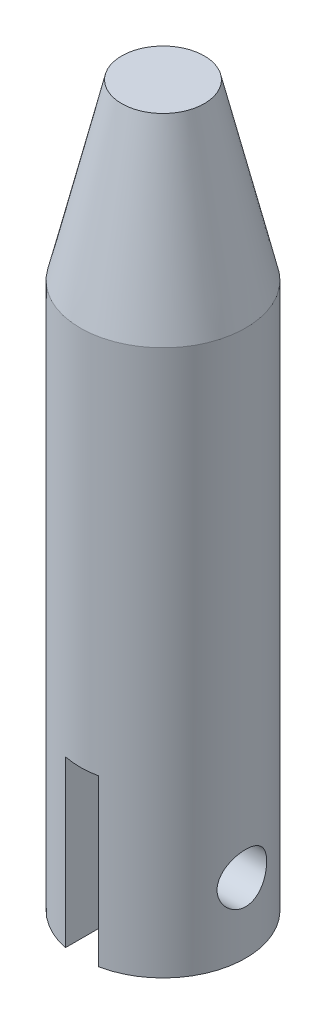
ISO-10303-21;
HEADER;
FILE_DESCRIPTION(('STEP AP214'),'2;1');
FILE_NAME('part.step','',(''),(''),'','','');
FILE_SCHEMA(('AUTOMOTIVE_DESIGN { 1 0 10303 214 1 1 1 1 }'));
ENDSEC;
DATA;
#1=APPLICATION_CONTEXT('core data for automotive mechanical design processes');
#2=APPLICATION_PROTOCOL_DEFINITION('international standard','automotive_design',2000,#1);
#3=PRODUCT_CONTEXT('',#1,'mechanical');
#4=PRODUCT('Part','Part','',(#3));
#5=PRODUCT_RELATED_PRODUCT_CATEGORY('part','',(#4));
#6=PRODUCT_DEFINITION_FORMATION('','',#4);
#7=PRODUCT_DEFINITION_CONTEXT('part definition',#1,'design');
#8=PRODUCT_DEFINITION('design','',#6,#7);
#9=PRODUCT_DEFINITION_SHAPE('','',#8);
#10=(LENGTH_UNIT() NAMED_UNIT(*) SI_UNIT(.MILLI.,.METRE.));
#11=(NAMED_UNIT(*) PLANE_ANGLE_UNIT() SI_UNIT($,.RADIAN.));
#12=(NAMED_UNIT(*) SI_UNIT($,.STERADIAN.) SOLID_ANGLE_UNIT());
#13=UNCERTAINTY_MEASURE_WITH_UNIT(LENGTH_MEASURE(1.E-05),#10,'distance_accuracy_value','');
#14=(GEOMETRIC_REPRESENTATION_CONTEXT(3) GLOBAL_UNCERTAINTY_ASSIGNED_CONTEXT((#13)) GLOBAL_UNIT_ASSIGNED_CONTEXT((#10,
#11,#12)) REPRESENTATION_CONTEXT('',''));
#15=CARTESIAN_POINT('',(0.,0.,0.));
#16=DIRECTION('',(0.,0.,1.));
#17=DIRECTION('',(1.,0.,0.));
#18=AXIS2_PLACEMENT_3D('',#15,#16,#17);
#19=CARTESIAN_POINT('',(0.,43.5,0.));
#20=DIRECTION('',(0.,-1.,0.));
#21=DIRECTION('',(0.,0.,-1.));
#22=AXIS2_PLACEMENT_3D('',#19,#20,#21);
#23=CYLINDRICAL_SURFACE('',#22,5.);
#24=CARTESIAN_POINT('',(0.,33.,0.));
#25=DIRECTION('',(0.,1.,0.));
#26=DIRECTION('',(0.,0.,1.));
#27=AXIS2_PLACEMENT_3D('',#24,#25,#26);
#28=CIRCLE('',#27,5.);
#29=CARTESIAN_POINT('',(0.,33.,5.));
#30=VERTEX_POINT('',#29);
#31=EDGE_CURVE('E93',#30,#30,#28,.T.);
#32=ORIENTED_EDGE('',*,*,#31,.F.);
#33=EDGE_LOOP('',(#32));
#34=FACE_BOUND('',#33,.T.);
#35=CARTESIAN_POINT('',(-4.76969600708473,4.2,-1.5));
#36=CARTESIAN_POINT('',(-4.7696968572698,4.1178054520576,-1.49999897633764));
#37=CARTESIAN_POINT('',(-4.77184390209069,4.03560077585598,-1.49322108167142));
#38=CARTESIAN_POINT('',(-4.780165783029,3.87359475040806,-1.46635844446749));
#39=CARTESIAN_POINT('',(-4.78634196493468,3.79379421349854,-1.44626925573578));
#40=CARTESIAN_POINT('',(-4.80196102485632,3.63896527172827,-1.39352753269955));
#41=CARTESIAN_POINT('',(-4.81139846703232,3.56392917036692,-1.36089589394243));
#42=CARTESIAN_POINT('',(-4.83246932547567,3.4203780660047,-1.28406421917929));
#43=CARTESIAN_POINT('',(-4.84410307041019,3.35186404131556,-1.23986245137053));
#44=CARTESIAN_POINT('',(-4.86866862185765,3.22113360942262,-1.13964754141627));
#45=CARTESIAN_POINT('',(-4.88162808311636,3.15915410205371,-1.08333207175807));
#46=CARTESIAN_POINT('',(-4.90714861936757,3.04536204867749,-0.961136237579599));
#47=CARTESIAN_POINT('',(-4.91970964297705,2.99355080955012,-0.895254645461111));
#48=CARTESIAN_POINT('',(-4.94333214579389,2.90053730016669,-0.75411143779369));
#49=CARTESIAN_POINT('',(-4.95435724342404,2.85957657555719,-0.678684021335814));
#50=CARTESIAN_POINT('',(-4.97334435920684,2.79101274095724,-0.521624645369354));
#51=CARTESIAN_POINT('',(-4.98130703789495,2.76340675014255,-0.439994028387912));
#52=CARTESIAN_POINT('',(-4.99307646003589,2.72311999890949,-0.27532385263083));
#53=CARTESIAN_POINT('',(-4.99699557369338,2.7100348723473,-0.192391398953801));
#54=CARTESIAN_POINT('',(-5.00063201501348,2.69788267535356,-0.0254218237493151));
#55=CARTESIAN_POINT('',(-5.00035022521079,2.69881266059804,0.0586150620503681));
#56=CARTESIAN_POINT('',(-4.99569603817658,2.71439286854302,0.22257115660016));
#57=CARTESIAN_POINT('',(-4.9914542020526,2.72860519380987,0.302536267641341));
#58=CARTESIAN_POINT('',(-4.97951522112593,2.76963133599429,0.458889213442527));
#59=CARTESIAN_POINT('',(-4.97181785750586,2.79644595094267,0.535276821322846));
#60=CARTESIAN_POINT('',(-4.95365220986963,2.86221202341856,0.683347326351281));
#61=CARTESIAN_POINT('',(-4.94315269676706,2.90130120280727,0.754965064694478));
#62=CARTESIAN_POINT('',(-4.92049640648069,2.99039785242823,0.890764673783156));
#63=CARTESIAN_POINT('',(-4.90833923637778,3.04040791296348,0.954944774872131));
#64=CARTESIAN_POINT('',(-4.88311550488165,3.1521977507516,1.0766604815298));
#65=CARTESIAN_POINT('',(-4.87003195321461,3.21435691902974,1.13384458040111));
#66=CARTESIAN_POINT('',(-4.84483979887497,3.34751001789005,1.23707651539824));
#67=CARTESIAN_POINT('',(-4.8327312931702,3.41850482538923,1.28312324482853));
#68=CARTESIAN_POINT('',(-4.81077903197678,3.56823946924899,1.3631399533545));
#69=CARTESIAN_POINT('',(-4.80095810695957,3.64704704586292,1.39698989237679));
#70=CARTESIAN_POINT('',(-4.78496392548436,3.80960720844554,1.45083362878413));
#71=CARTESIAN_POINT('',(-4.7787894791583,3.89335817153456,1.4708319464056));
#72=CARTESIAN_POINT('',(-4.77104849541241,4.06008236073928,1.49574770282165));
#73=CARTESIAN_POINT('',(-4.7693187867044,4.14296822389398,1.50119946380212));
#74=CARTESIAN_POINT('',(-4.77021192441924,4.30847290000987,1.49835947233062));
#75=CARTESIAN_POINT('',(-4.77283416156589,4.39109174873085,1.4900696437133));
#76=CARTESIAN_POINT('',(-4.78197558554912,4.55148837797087,1.4604576357419));
#77=CARTESIAN_POINT('',(-4.78839176507489,4.62933616426352,1.4394796143128));
#78=CARTESIAN_POINT('',(-4.80429141231227,4.78040169081492,1.3854857774794));
#79=CARTESIAN_POINT('',(-4.81377535359073,4.85361871414057,1.3524681034276));
#80=CARTESIAN_POINT('',(-4.83505835023047,4.99551746407213,1.274318711965));
#81=CARTESIAN_POINT('',(-4.84691271069799,5.06402472098579,1.22888564172729));
#82=CARTESIAN_POINT('',(-4.87148205646987,5.1926381061808,1.12755301600385));
#83=CARTESIAN_POINT('',(-4.88419724730003,5.25274221761279,1.07165095534897));
#84=CARTESIAN_POINT('',(-4.90963633548158,5.36518040581474,0.948455132493599));
#85=CARTESIAN_POINT('',(-4.92234245063004,5.41713562898698,0.880811065857434));
#86=CARTESIAN_POINT('',(-4.9458485174865,5.50896670102775,0.737461784590248));
#87=CARTESIAN_POINT('',(-4.95664856384717,5.54884314978146,0.661756970543943));
#88=CARTESIAN_POINT('',(-4.97505970474957,5.6150000305683,0.504935504705221));
#89=CARTESIAN_POINT('',(-4.98269453424965,5.64138201615898,0.423864622037839));
#90=CARTESIAN_POINT('',(-4.99401979596827,5.68006091889042,0.258169966504588));
#91=CARTESIAN_POINT('',(-4.9977113567088,5.69236186594842,0.173547217354763));
#92=CARTESIAN_POINT('',(-5.00066544081399,5.7022230440545,0.00665215388274314));
#93=CARTESIAN_POINT('',(-5.00009305111322,5.70033269540783,-0.0755851790862063));
#94=CARTESIAN_POINT('',(-4.99497264465036,5.68317836750088,-0.238519481164404));
#95=CARTESIAN_POINT('',(-4.99042485330462,5.66791514651956,-0.319216537346528));
#96=CARTESIAN_POINT('',(-4.97791168358326,5.62478833860038,-0.475935813041358));
#97=CARTESIAN_POINT('',(-4.96998352900866,5.59706181935099,-0.551998927351392));
#98=CARTESIAN_POINT('',(-4.9515294303945,5.52991808549281,-0.698433237752053));
#99=CARTESIAN_POINT('',(-4.94100305949946,5.49049894971381,-0.76880349605058));
#100=CARTESIAN_POINT('',(-4.91803965828228,5.39962654256997,-0.904301892420563));
#101=CARTESIAN_POINT('',(-4.90555226923559,5.34782856999923,-0.969190250076766));
#102=CARTESIAN_POINT('',(-4.88023537212334,5.2342896116672,-1.08953757134594));
#103=CARTESIAN_POINT('',(-4.86740576641079,5.17254576210185,-1.14499380960193));
#104=CARTESIAN_POINT('',(-4.84240680631319,5.03865922168949,-1.24656269394549));
#105=CARTESIAN_POINT('',(-4.83026852693485,4.96626144660956,-1.29234759757956));
#106=CARTESIAN_POINT('',(-4.80852547508793,4.81444482583898,-1.37104313528776));
#107=CARTESIAN_POINT('',(-4.79891948596955,4.7350293763988,-1.40395995557289));
#108=CARTESIAN_POINT('',(-4.78427816717594,4.58025956839373,-1.4530194253295));
#109=CARTESIAN_POINT('',(-4.7788615484052,4.50539135306901,-1.47058859011232));
#110=CARTESIAN_POINT('',(-4.77157042597167,4.35368477750423,-1.49407818835144));
#111=CARTESIAN_POINT('',(-4.7696952122143,4.27684681535475,-1.50000095706095));
#112=CARTESIAN_POINT('',(-4.76969600708473,4.2,-1.5));
#113=B_SPLINE_CURVE_WITH_KNOTS('',3,(#35,#36,#37,#38,#39,#40,#41,#42,#43,#44,#45,#46,#47,#48,
#49,#50,#51,#52,#53,#54,#55,#56,#57,#58,#59,#60,#61,#62,#63,#64,#65,#66,#67,#68,#69,#70,#71,#72,
#73,#74,#75,#76,#77,#78,#79,#80,#81,#82,#83,#84,#85,#86,#87,#88,#89,#90,#91,#92,#93,#94,#95,#96,
#97,#98,#99,#100,#101,#102,#103,#104,#105,#106,#107,#108,#109,#110,#111,#112),.UNSPECIFIED.,.T.,
.F.,(4,2,2,2,2,2,2,2,2,2,2,2,2,2,2,2,2,2,2,2,2,2,2,2,2,2,2,2,2,2,2,2,2,2,2,2,2,2,4),(0.,
0.246300165915542,0.492682641689,0.738656414466193,0.984667025370101,1.23773150007984,
1.49082847871273,1.74915939273645,2.00743455587877,2.25832140149558,2.5091555410144,
2.7520012599088,2.99486235890376,3.24055209335676,3.48630016590831,3.74152147023278,
3.99676812491863,4.25446238246266,4.51207250628411,4.76008080790309,5.00805439107388,
5.24958594938817,5.49115481045787,5.73920731809388,5.98731925928923,6.24479506100602,
6.50225807324202,6.75775391814325,7.01317662321682,7.2587630391122,7.50433553047755,
7.74727096872219,7.99024634491378,8.24099627054488,8.4918185262989,8.75011639669147,
9.00828993963944,9.23861153857448,9.4688869503356),.UNSPECIFIED.);
#114=CARTESIAN_POINT('',(-4.76969600708473,4.2,-1.5));
#115=VERTEX_POINT('',#114);
#116=EDGE_CURVE('E106',#115,#115,#113,.T.);
#117=ORIENTED_EDGE('',*,*,#116,.F.);
#118=EDGE_LOOP('',(#117));
#119=FACE_BOUND('',#118,.T.);
#120=CARTESIAN_POINT('',(4.76969600708473,4.2,1.5));
#121=CARTESIAN_POINT('',(4.7696968572698,4.2821945479424,1.49999897633764));
#122=CARTESIAN_POINT('',(4.77184390209069,4.36439922414402,1.49322108167142));
#123=CARTESIAN_POINT('',(4.780165783029,4.52640524959194,1.46635844446749));
#124=CARTESIAN_POINT('',(4.78634196493468,4.60620578650147,1.44626925573578));
#125=CARTESIAN_POINT('',(4.80196102485632,4.76103472827173,1.39352753269955));
#126=CARTESIAN_POINT('',(4.81139846703232,4.83607082963309,1.36089589394243));
#127=CARTESIAN_POINT('',(4.83246932547567,4.9796219339953,1.28406421917929));
#128=CARTESIAN_POINT('',(4.84410307041019,5.04813595868444,1.23986245137053));
#129=CARTESIAN_POINT('',(4.86866862185765,5.17886639057738,1.13964754141627));
#130=CARTESIAN_POINT('',(4.88162808311636,5.24084589794629,1.08333207175807));
#131=CARTESIAN_POINT('',(4.90714861936757,5.35463795132251,0.961136237579599));
#132=CARTESIAN_POINT('',(4.91970964297705,5.40644919044988,0.895254645461111));
#133=CARTESIAN_POINT('',(4.94333214579389,5.49946269983331,0.75411143779369));
#134=CARTESIAN_POINT('',(4.95435724342404,5.54042342444281,0.678684021335814));
#135=CARTESIAN_POINT('',(4.97334435920684,5.60898725904276,0.521624645369353));
#136=CARTESIAN_POINT('',(4.98130703789495,5.63659324985745,0.439994028387911));
#137=CARTESIAN_POINT('',(4.99307646003589,5.67688000109051,0.275323852630829));
#138=CARTESIAN_POINT('',(4.99699557369338,5.6899651276527,0.192391398953801));
#139=CARTESIAN_POINT('',(5.00063201501348,5.70211732464644,0.0254218237493147));
#140=CARTESIAN_POINT('',(5.00035022521079,5.70118733940196,-0.0586150620503685));
#141=CARTESIAN_POINT('',(4.99569603817658,5.68560713145698,-0.22257115660016));
#142=CARTESIAN_POINT('',(4.9914542020526,5.67139480619013,-0.302536267641342));
#143=CARTESIAN_POINT('',(4.97951522112593,5.63036866400571,-0.458889213442527));
#144=CARTESIAN_POINT('',(4.97181785750586,5.60355404905733,-0.535276821322846));
#145=CARTESIAN_POINT('',(4.95365220986963,5.53778797658144,-0.683347326351281));
#146=CARTESIAN_POINT('',(4.94315269676706,5.49869879719273,-0.754965064694478));
#147=CARTESIAN_POINT('',(4.92049640648069,5.40960214757177,-0.890764673783156));
#148=CARTESIAN_POINT('',(4.90833923637778,5.35959208703652,-0.954944774872131));
#149=CARTESIAN_POINT('',(4.88311550488165,5.2478022492484,-1.0766604815298));
#150=CARTESIAN_POINT('',(4.87003195321461,5.18564308097026,-1.13384458040111));
#151=CARTESIAN_POINT('',(4.84483979887497,5.05248998210995,-1.23707651539824));
#152=CARTESIAN_POINT('',(4.8327312931702,4.98149517461077,-1.28312324482853));
#153=CARTESIAN_POINT('',(4.81077903197678,4.83176053075101,-1.3631399533545));
#154=CARTESIAN_POINT('',(4.80095810695957,4.75295295413708,-1.39698989237679));
#155=CARTESIAN_POINT('',(4.78496392548436,4.59039279155446,-1.45083362878413));
#156=CARTESIAN_POINT('',(4.7787894791583,4.50664182846544,-1.4708319464056));
#157=CARTESIAN_POINT('',(4.77104849541241,4.33991763926072,-1.49574770282165));
#158=CARTESIAN_POINT('',(4.7693187867044,4.25703177610602,-1.50119946380212));
#159=CARTESIAN_POINT('',(4.77021192441924,4.09152709999013,-1.49835947233062));
#160=CARTESIAN_POINT('',(4.77283416156589,4.00890825126915,-1.4900696437133));
#161=CARTESIAN_POINT('',(4.78197558554912,3.84851162202913,-1.4604576357419));
#162=CARTESIAN_POINT('',(4.78839176507489,3.77066383573648,-1.4394796143128));
#163=CARTESIAN_POINT('',(4.80429141231227,3.61959830918508,-1.3854857774794));
#164=CARTESIAN_POINT('',(4.81377535359073,3.54638128585943,-1.3524681034276));
#165=CARTESIAN_POINT('',(4.83505835023047,3.40448253592787,-1.274318711965));
#166=CARTESIAN_POINT('',(4.84691271069799,3.33597527901421,-1.22888564172729));
#167=CARTESIAN_POINT('',(4.87148205646987,3.2073618938192,-1.12755301600385));
#168=CARTESIAN_POINT('',(4.88419724730003,3.14725778238721,-1.07165095534897));
#169=CARTESIAN_POINT('',(4.90963633548158,3.03481959418526,-0.948455132493599));
#170=CARTESIAN_POINT('',(4.92234245063004,2.98286437101302,-0.880811065857434));
#171=CARTESIAN_POINT('',(4.9458485174865,2.89103329897225,-0.737461784590249));
#172=CARTESIAN_POINT('',(4.95664856384717,2.85115685021854,-0.661756970543944));
#173=CARTESIAN_POINT('',(4.97505970474957,2.78499996943171,-0.504935504705222));
#174=CARTESIAN_POINT('',(4.98269453424965,2.75861798384103,-0.423864622037839));
#175=CARTESIAN_POINT('',(4.99401979596827,2.71993908110958,-0.258169966504588));
#176=CARTESIAN_POINT('',(4.9977113567088,2.70763813405158,-0.173547217354763));
#177=CARTESIAN_POINT('',(5.00066544081399,2.6977769559455,-0.00665215388274299));
#178=CARTESIAN_POINT('',(5.00009305111322,2.69966730459217,0.0755851790862064));
#179=CARTESIAN_POINT('',(4.99497264465036,2.71682163249912,0.238519481164404));
#180=CARTESIAN_POINT('',(4.99042485330462,2.73208485348044,0.319216537346528));
#181=CARTESIAN_POINT('',(4.97791168358326,2.77521166139963,0.475935813041358));
#182=CARTESIAN_POINT('',(4.96998352900866,2.80293818064901,0.551998927351392));
#183=CARTESIAN_POINT('',(4.9515294303945,2.87008191450719,0.698433237752053));
#184=CARTESIAN_POINT('',(4.94100305949946,2.90950105028619,0.76880349605058));
#185=CARTESIAN_POINT('',(4.91803965828228,3.00037345743004,0.904301892420563));
#186=CARTESIAN_POINT('',(4.90555226923559,3.05217143000077,0.969190250076767));
#187=CARTESIAN_POINT('',(4.88023537212334,3.1657103883328,1.08953757134595));
#188=CARTESIAN_POINT('',(4.86740576641079,3.22745423789815,1.14499380960194));
#189=CARTESIAN_POINT('',(4.84240680631319,3.36134077831051,1.24656269394549));
#190=CARTESIAN_POINT('',(4.83026852693485,3.43373855339044,1.29234759757956));
#191=CARTESIAN_POINT('',(4.80852547508793,3.58555517416102,1.37104313528776));
#192=CARTESIAN_POINT('',(4.79891948596955,3.6649706236012,1.40395995557289));
#193=CARTESIAN_POINT('',(4.78427816717594,3.81974043160627,1.4530194253295));
#194=CARTESIAN_POINT('',(4.7788615484052,3.89460864693099,1.47058859011232));
#195=CARTESIAN_POINT('',(4.77157042597167,4.04631522249577,1.49407818835144));
#196=CARTESIAN_POINT('',(4.7696952122143,4.12315318464525,1.50000095706095));
#197=CARTESIAN_POINT('',(4.76969600708473,4.2,1.5));
#198=B_SPLINE_CURVE_WITH_KNOTS('',3,(#120,#121,#122,#123,#124,#125,#126,#127,#128,#129,#130,
#131,#132,#133,#134,#135,#136,#137,#138,#139,#140,#141,#142,#143,#144,#145,#146,#147,#148,#149,
#150,#151,#152,#153,#154,#155,#156,#157,#158,#159,#160,#161,#162,#163,#164,#165,#166,#167,#168,
#169,#170,#171,#172,#173,#174,#175,#176,#177,#178,#179,#180,#181,#182,#183,#184,#185,#186,#187,
#188,#189,#190,#191,#192,#193,#194,#195,#196,#197),.UNSPECIFIED.,.T.,.F.,(4,2,2,2,2,2,2,2,2,2,2,
2,2,2,2,2,2,2,2,2,2,2,2,2,2,2,2,2,2,2,2,2,2,2,2,2,2,2,4),(0.,0.246300165915542,0.492682641689,
0.738656414466193,0.984667025370101,1.23773150007984,1.49082847871273,1.74915939273645,
2.00743455587877,2.25832140149558,2.5091555410144,2.7520012599088,2.99486235890376,
3.24055209335676,3.4863001659083,3.74152147023278,3.99676812491863,4.25446238246266,
4.51207250628411,4.76008080790309,5.00805439107388,5.24958594938817,5.49115481045787,
5.73920731809388,5.98731925928923,6.24479506100602,6.50225807324202,6.75775391814325,
7.01317662321682,7.2587630391122,7.50433553047754,7.74727096872219,7.99024634491378,
8.24099627054488,8.4918185262989,8.75011639669147,9.00828993963944,9.23861153857448,
9.4688869503356),.UNSPECIFIED.);
#199=CARTESIAN_POINT('',(4.76969600708473,4.2,1.5));
#200=VERTEX_POINT('',#199);
#201=EDGE_CURVE('E97',#200,#200,#198,.T.);
#202=ORIENTED_EDGE('',*,*,#201,.T.);
#203=EDGE_LOOP('',(#202));
#204=FACE_BOUND('',#203,.T.);
#205=DIRECTION('',(0.,-1.,0.));
#206=VECTOR('',#205,1.);
#207=CARTESIAN_POINT('',(-1.,43.5,4.89897948556635));
#208=LINE('',#207,#206);
#209=CARTESIAN_POINT('',(-0.999999999999999,0.,4.89897948556636));
#210=VERTEX_POINT('',#209);
#211=CARTESIAN_POINT('',(-1.,10.,4.89897948556635));
#212=VERTEX_POINT('',#211);
#213=EDGE_CURVE('E78',#210,#212,#208,.F.);
#214=ORIENTED_EDGE('',*,*,#213,.T.);
#215=CARTESIAN_POINT('',(0.,10.,0.));
#216=DIRECTION('',(0.,-1.,0.));
#217=DIRECTION('',(0.,0.,-1.));
#218=AXIS2_PLACEMENT_3D('',#215,#216,#217);
#219=CIRCLE('',#218,5.);
#220=CARTESIAN_POINT('',(1.,10.,4.89897948556635));
#221=VERTEX_POINT('',#220);
#222=EDGE_CURVE('E82',#212,#221,#219,.F.);
#223=ORIENTED_EDGE('',*,*,#222,.T.);
#224=DIRECTION('',(0.,-1.,0.));
#225=VECTOR('',#224,1.);
#226=CARTESIAN_POINT('',(1.,43.5,4.89897948556635));
#227=LINE('',#226,#225);
#228=CARTESIAN_POINT('',(0.999999999999999,0.,4.89897948556636));
#229=VERTEX_POINT('',#228);
#230=EDGE_CURVE('E51',#221,#229,#227,.T.);
#231=ORIENTED_EDGE('',*,*,#230,.T.);
#232=CARTESIAN_POINT('',(0.,0.,0.));
#233=DIRECTION('',(0.,1.,0.));
#234=DIRECTION('',(0.,0.,1.));
#235=AXIS2_PLACEMENT_3D('',#232,#233,#234);
#236=CIRCLE('',#235,5.);
#237=CARTESIAN_POINT('',(0.999999999999999,0.,-4.89897948556636));
#238=VERTEX_POINT('',#237);
#239=EDGE_CURVE('E11',#229,#238,#236,.T.);
#240=ORIENTED_EDGE('',*,*,#239,.T.);
#241=DIRECTION('',(0.,-1.,0.));
#242=VECTOR('',#241,1.);
#243=CARTESIAN_POINT('',(1.,43.5,-4.89897948556635));
#244=LINE('',#243,#242);
#245=CARTESIAN_POINT('',(1.,10.,-4.89897948556635));
#246=VERTEX_POINT('',#245);
#247=EDGE_CURVE('E46',#246,#238,#244,.T.);
#248=ORIENTED_EDGE('',*,*,#247,.F.);
#249=CARTESIAN_POINT('',(0.,10.,0.));
#250=DIRECTION('',(0.,1.,0.));
#251=DIRECTION('',(0.,0.,1.));
#252=AXIS2_PLACEMENT_3D('',#249,#250,#251);
#253=CIRCLE('',#252,5.);
#254=CARTESIAN_POINT('',(-1.,10.,-4.89897948556635));
#255=VERTEX_POINT('',#254);
#256=EDGE_CURVE('E87',#255,#246,#253,.F.);
#257=ORIENTED_EDGE('',*,*,#256,.F.);
#258=DIRECTION('',(0.,-1.,0.));
#259=VECTOR('',#258,1.);
#260=CARTESIAN_POINT('',(-1.,43.5,-4.89897948556635));
#261=LINE('',#260,#259);
#262=CARTESIAN_POINT('',(-0.999999999999999,0.,-4.89897948556636));
#263=VERTEX_POINT('',#262);
#264=EDGE_CURVE('E75',#263,#255,#261,.F.);
#265=ORIENTED_EDGE('',*,*,#264,.F.);
#266=EDGE_CURVE('E39',#263,#210,#236,.T.);
#267=ORIENTED_EDGE('',*,*,#266,.T.);
#268=EDGE_LOOP('',(#214,#223,#231,#240,#248,#257,#265,#267));
#269=FACE_BOUND('',#268,.T.);
#270=ADVANCED_FACE('F32',(#34,#119,#204,#269),#23,.T.);
#271=CARTESIAN_POINT('',(0.,0.,0.));
#272=DIRECTION('',(0.,1.,0.));
#273=DIRECTION('',(0.,0.,1.));
#274=AXIS2_PLACEMENT_3D('',#271,#272,#273);
#275=PLANE('',#274);
#276=DIRECTION('',(0.,0.,-1.));
#277=VECTOR('',#276,1.);
#278=CARTESIAN_POINT('',(-0.999999999999999,0.,5.001));
#279=LINE('',#278,#277);
#280=EDGE_CURVE('E71',#210,#263,#279,.T.);
#281=ORIENTED_EDGE('',*,*,#280,.F.);
#282=ORIENTED_EDGE('',*,*,#266,.F.);
#283=EDGE_LOOP('',(#281,#282));
#284=FACE_BOUND('',#283,.T.);
#285=ADVANCED_FACE('F90',(#284),#275,.F.);
#286=DIRECTION('',(0.,0.,-1.));
#287=VECTOR('',#286,1.);
#288=CARTESIAN_POINT('',(0.999999999999999,0.,5.001));
#289=LINE('',#288,#287);
#290=EDGE_CURVE('E83',#229,#238,#289,.T.);
#291=ORIENTED_EDGE('',*,*,#290,.T.);
#292=ORIENTED_EDGE('',*,*,#239,.F.);
#293=EDGE_LOOP('',(#291,#292));
#294=FACE_BOUND('',#293,.T.);
#295=ADVANCED_FACE('F136',(#294),#275,.F.);
#296=CARTESIAN_POINT('',(5.001,4.2,0.));
#297=DIRECTION('',(-1.,0.,0.));
#298=DIRECTION('',(0.,0.,1.));
#299=AXIS2_PLACEMENT_3D('',#296,#297,#298);
#300=CYLINDRICAL_SURFACE('',#299,1.5);
#301=ORIENTED_EDGE('',*,*,#116,.T.);
#302=EDGE_LOOP('',(#301));
#303=FACE_BOUND('',#302,.T.);
#304=CARTESIAN_POINT('',(-0.999999999999999,4.2,0.));
#305=DIRECTION('',(1.,0.,0.));
#306=DIRECTION('',(0.,1.,0.));
#307=AXIS2_PLACEMENT_3D('',#304,#305,#306);
#308=CIRCLE('',#307,1.5);
#309=CARTESIAN_POINT('',(-0.999999999999999,5.7,0.));
#310=VERTEX_POINT('',#309);
#311=EDGE_CURVE('E151',#310,#310,#308,.F.);
#312=ORIENTED_EDGE('',*,*,#311,.F.);
#313=EDGE_LOOP('',(#312));
#314=FACE_BOUND('',#313,.T.);
#315=ADVANCED_FACE('F112',(#303,#314),#300,.F.);
#316=ORIENTED_EDGE('',*,*,#201,.F.);
#317=EDGE_LOOP('',(#316));
#318=FACE_BOUND('',#317,.T.);
#319=CARTESIAN_POINT('',(0.999999999999999,4.2,0.));
#320=DIRECTION('',(-1.,0.,0.));
#321=DIRECTION('',(0.,-1.,0.));
#322=AXIS2_PLACEMENT_3D('',#319,#320,#321);
#323=CIRCLE('',#322,1.5);
#324=CARTESIAN_POINT('',(0.999999999999999,2.7,0.));
#325=VERTEX_POINT('',#324);
#326=EDGE_CURVE('E88',#325,#325,#323,.F.);
#327=ORIENTED_EDGE('',*,*,#326,.F.);
#328=EDGE_LOOP('',(#327));
#329=FACE_BOUND('',#328,.T.);
#330=ADVANCED_FACE('F144',(#318,#329),#300,.F.);
#331=CARTESIAN_POINT('',(0.,43.5,0.));
#332=DIRECTION('',(0.,-1.,0.));
#333=DIRECTION('',(0.,0.,-1.));
#334=AXIS2_PLACEMENT_3D('',#331,#332,#333);
#335=CONICAL_SURFACE('',#334,2.5,0.233743180868901);
#336=ORIENTED_EDGE('',*,*,#31,.T.);
#337=EDGE_LOOP('',(#336));
#338=FACE_BOUND('',#337,.T.);
#339=CARTESIAN_POINT('',(0.,43.5,0.));
#340=DIRECTION('',(0.,1.,0.));
#341=DIRECTION('',(0.,0.,1.));
#342=AXIS2_PLACEMENT_3D('',#339,#340,#341);
#343=CIRCLE('',#342,2.5);
#344=CARTESIAN_POINT('',(0.,43.5,2.5));
#345=VERTEX_POINT('',#344);
#346=EDGE_CURVE('E91',#345,#345,#343,.T.);
#347=ORIENTED_EDGE('',*,*,#346,.F.);
#348=EDGE_LOOP('',(#347));
#349=FACE_BOUND('',#348,.T.);
#350=ADVANCED_FACE('F147',(#338,#349),#335,.T.);
#351=CARTESIAN_POINT('',(0.,43.5,0.));
#352=DIRECTION('',(0.,1.,0.));
#353=DIRECTION('',(0.,0.,1.));
#354=AXIS2_PLACEMENT_3D('',#351,#352,#353);
#355=PLANE('',#354);
#356=ORIENTED_EDGE('',*,*,#346,.T.);
#357=EDGE_LOOP('',(#356));
#358=FACE_BOUND('',#357,.T.);
#359=ADVANCED_FACE('F122',(#358),#355,.T.);
#360=CARTESIAN_POINT('',(-1.,10.,5.001));
#361=DIRECTION('',(1.,0.,0.));
#362=DIRECTION('',(0.,1.,0.));
#363=AXIS2_PLACEMENT_3D('',#360,#361,#362);
#364=PLANE('',#363);
#365=ORIENTED_EDGE('',*,*,#311,.T.);
#366=EDGE_LOOP('',(#365));
#367=FACE_BOUND('',#366,.T.);
#368=ORIENTED_EDGE('',*,*,#280,.T.);
#369=ORIENTED_EDGE('',*,*,#264,.T.);
#370=DIRECTION('',(0.,0.,-1.));
#371=VECTOR('',#370,1.);
#372=CARTESIAN_POINT('',(-1.,10.,5.001));
#373=LINE('',#372,#371);
#374=EDGE_CURVE('E159',#212,#255,#373,.T.);
#375=ORIENTED_EDGE('',*,*,#374,.F.);
#376=ORIENTED_EDGE('',*,*,#213,.F.);
#377=EDGE_LOOP('',(#368,#369,#375,#376));
#378=FACE_BOUND('',#377,.T.);
#379=ADVANCED_FACE('F73',(#367,#378),#364,.T.);
#380=CARTESIAN_POINT('',(0.999999999999999,0.,5.001));
#381=DIRECTION('',(-1.,0.,0.));
#382=DIRECTION('',(0.,-1.,0.));
#383=AXIS2_PLACEMENT_3D('',#380,#381,#382);
#384=PLANE('',#383);
#385=ORIENTED_EDGE('',*,*,#247,.T.);
#386=ORIENTED_EDGE('',*,*,#290,.F.);
#387=ORIENTED_EDGE('',*,*,#230,.F.);
#388=DIRECTION('',(0.,0.,-1.));
#389=VECTOR('',#388,1.);
#390=CARTESIAN_POINT('',(1.,10.,5.001));
#391=LINE('',#390,#389);
#392=EDGE_CURVE('E161',#221,#246,#391,.T.);
#393=ORIENTED_EDGE('',*,*,#392,.T.);
#394=EDGE_LOOP('',(#385,#386,#387,#393));
#395=FACE_BOUND('',#394,.T.);
#396=ORIENTED_EDGE('',*,*,#326,.T.);
#397=EDGE_LOOP('',(#396));
#398=FACE_BOUND('',#397,.T.);
#399=ADVANCED_FACE('F121',(#395,#398),#384,.T.);
#400=CARTESIAN_POINT('',(1.,10.,5.001));
#401=DIRECTION('',(0.,-1.,0.));
#402=DIRECTION('',(0.,0.,-1.));
#403=AXIS2_PLACEMENT_3D('',#400,#401,#402);
#404=PLANE('',#403);
#405=ORIENTED_EDGE('',*,*,#374,.T.);
#406=ORIENTED_EDGE('',*,*,#256,.T.);
#407=ORIENTED_EDGE('',*,*,#392,.F.);
#408=ORIENTED_EDGE('',*,*,#222,.F.);
#409=EDGE_LOOP('',(#405,#406,#407,#408));
#410=FACE_BOUND('',#409,.T.);
#411=ADVANCED_FACE('F126',(#410),#404,.T.);
#412=CLOSED_SHELL('',(#270,#285,#295,#315,#330,#350,#359,#379,#399,#411));
#413=MANIFOLD_SOLID_BREP('B2',#412);
#414=ADVANCED_BREP_SHAPE_REPRESENTATION('',(#18,#413),#14);
#415=SHAPE_DEFINITION_REPRESENTATION(#9,#414);
ENDSEC;
END-ISO-10303-21;
